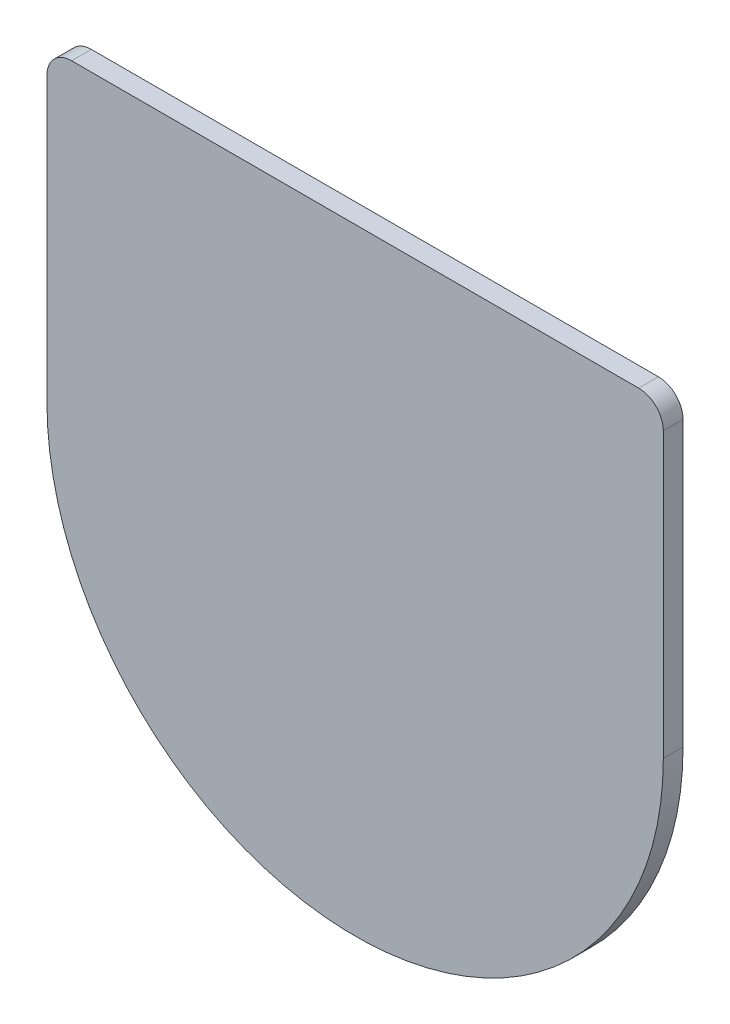
ISO-10303-21;
HEADER;
FILE_DESCRIPTION(('STEP AP214'),'2;1');
FILE_NAME('part.step','',(''),(''),'','','');
FILE_SCHEMA(('AUTOMOTIVE_DESIGN { 1 0 10303 214 1 1 1 1 }'));
ENDSEC;
DATA;
#1=APPLICATION_CONTEXT('core data for automotive mechanical design processes');
#2=APPLICATION_PROTOCOL_DEFINITION('international standard','automotive_design',2000,#1);
#3=PRODUCT_CONTEXT('',#1,'mechanical');
#4=PRODUCT('Part','Part','',(#3));
#5=PRODUCT_RELATED_PRODUCT_CATEGORY('part','',(#4));
#6=PRODUCT_DEFINITION_FORMATION('','',#4);
#7=PRODUCT_DEFINITION_CONTEXT('part definition',#1,'design');
#8=PRODUCT_DEFINITION('design','',#6,#7);
#9=PRODUCT_DEFINITION_SHAPE('','',#8);
#10=(LENGTH_UNIT() NAMED_UNIT(*) SI_UNIT(.MILLI.,.METRE.));
#11=(NAMED_UNIT(*) PLANE_ANGLE_UNIT() SI_UNIT($,.RADIAN.));
#12=(NAMED_UNIT(*) SI_UNIT($,.STERADIAN.) SOLID_ANGLE_UNIT());
#13=UNCERTAINTY_MEASURE_WITH_UNIT(LENGTH_MEASURE(1.E-05),#10,'distance_accuracy_value','');
#14=(GEOMETRIC_REPRESENTATION_CONTEXT(3) GLOBAL_UNCERTAINTY_ASSIGNED_CONTEXT((#13)) GLOBAL_UNIT_ASSIGNED_CONTEXT((#10,
#11,#12)) REPRESENTATION_CONTEXT('',''));
#15=CARTESIAN_POINT('',(0.,0.,0.));
#16=DIRECTION('',(0.,0.,1.));
#17=DIRECTION('',(1.,0.,0.));
#18=AXIS2_PLACEMENT_3D('',#15,#16,#17);
#19=CARTESIAN_POINT('',(0.,-62.5,8.));
#20=DIRECTION('',(0.,0.,-1.));
#21=DIRECTION('',(-1.,0.,0.));
#22=AXIS2_PLACEMENT_3D('',#19,#20,#21);
#23=CYLINDRICAL_SURFACE('',#22,125.);
#24=CARTESIAN_POINT('',(0.,-62.5,0.));
#25=DIRECTION('',(0.,0.,1.));
#26=DIRECTION('',(1.,0.,0.));
#27=AXIS2_PLACEMENT_3D('',#24,#25,#26);
#28=CIRCLE('',#27,125.);
#29=CARTESIAN_POINT('',(-125.,-62.5,0.));
#30=VERTEX_POINT('',#29);
#31=CARTESIAN_POINT('',(125.,-62.5,0.));
#32=VERTEX_POINT('',#31);
#33=EDGE_CURVE('E121',#30,#32,#28,.T.);
#34=ORIENTED_EDGE('',*,*,#33,.T.);
#35=DIRECTION('',(0.,0.,-1.));
#36=VECTOR('',#35,1.);
#37=CARTESIAN_POINT('',(125.,-62.5,8.));
#38=LINE('',#37,#36);
#39=CARTESIAN_POINT('',(125.,-62.5,8.));
#40=VERTEX_POINT('',#39);
#41=EDGE_CURVE('E11',#40,#32,#38,.T.);
#42=ORIENTED_EDGE('',*,*,#41,.F.);
#43=CARTESIAN_POINT('',(0.,-62.5,8.));
#44=DIRECTION('',(0.,0.,1.));
#45=DIRECTION('',(1.,0.,0.));
#46=AXIS2_PLACEMENT_3D('',#43,#44,#45);
#47=CIRCLE('',#46,125.);
#48=CARTESIAN_POINT('',(-125.,-62.5,8.));
#49=VERTEX_POINT('',#48);
#50=EDGE_CURVE('E131',#49,#40,#47,.T.);
#51=ORIENTED_EDGE('',*,*,#50,.F.);
#52=DIRECTION('',(0.,0.,-1.));
#53=VECTOR('',#52,1.);
#54=CARTESIAN_POINT('',(-125.,-62.5,8.));
#55=LINE('',#54,#53);
#56=EDGE_CURVE('E117',#49,#30,#55,.T.);
#57=ORIENTED_EDGE('',*,*,#56,.T.);
#58=EDGE_LOOP('',(#34,#42,#51,#57));
#59=FACE_BOUND('',#58,.T.);
#60=ADVANCED_FACE('F37',(#59),#23,.T.);
#61=CARTESIAN_POINT('',(125.,-62.5,8.));
#62=DIRECTION('',(-1.,0.,0.));
#63=DIRECTION('',(0.,-1.,0.));
#64=AXIS2_PLACEMENT_3D('',#61,#62,#63);
#65=PLANE('',#64);
#66=DIRECTION('',(0.,1.,0.));
#67=VECTOR('',#66,1.);
#68=CARTESIAN_POINT('',(125.,-62.5,0.));
#69=LINE('',#68,#67);
#70=CARTESIAN_POINT('',(125.,52.5,0.));
#71=VERTEX_POINT('',#70);
#72=EDGE_CURVE('E124',#32,#71,#69,.T.);
#73=ORIENTED_EDGE('',*,*,#72,.T.);
#74=DIRECTION('',(0.,0.,-1.));
#75=VECTOR('',#74,1.);
#76=CARTESIAN_POINT('',(125.,52.5,8.));
#77=LINE('',#76,#75);
#78=CARTESIAN_POINT('',(125.,52.5,8.));
#79=VERTEX_POINT('',#78);
#80=EDGE_CURVE('E45',#79,#71,#77,.T.);
#81=ORIENTED_EDGE('',*,*,#80,.F.);
#82=DIRECTION('',(0.,1.,0.));
#83=VECTOR('',#82,1.);
#84=CARTESIAN_POINT('',(125.,-62.5,8.));
#85=LINE('',#84,#83);
#86=EDGE_CURVE('E90',#40,#79,#85,.T.);
#87=ORIENTED_EDGE('',*,*,#86,.F.);
#88=ORIENTED_EDGE('',*,*,#41,.T.);
#89=EDGE_LOOP('',(#73,#81,#87,#88));
#90=FACE_BOUND('',#89,.T.);
#91=ADVANCED_FACE('F155',(#90),#65,.F.);
#92=CARTESIAN_POINT('',(115.,52.5,8.));
#93=DIRECTION('',(0.,0.,-1.));
#94=DIRECTION('',(-1.,0.,0.));
#95=AXIS2_PLACEMENT_3D('',#92,#93,#94);
#96=CYLINDRICAL_SURFACE('',#95,10.);
#97=CARTESIAN_POINT('',(115.,52.5,0.));
#98=DIRECTION('',(0.,0.,1.));
#99=DIRECTION('',(-1.,0.,0.));
#100=AXIS2_PLACEMENT_3D('',#97,#98,#99);
#101=CIRCLE('',#100,10.);
#102=CARTESIAN_POINT('',(115.,62.5,0.));
#103=VERTEX_POINT('',#102);
#104=EDGE_CURVE('E126',#71,#103,#101,.T.);
#105=ORIENTED_EDGE('',*,*,#104,.T.);
#106=DIRECTION('',(0.,0.,-1.));
#107=VECTOR('',#106,1.);
#108=CARTESIAN_POINT('',(115.,62.5,8.));
#109=LINE('',#108,#107);
#110=CARTESIAN_POINT('',(115.,62.5,8.));
#111=VERTEX_POINT('',#110);
#112=EDGE_CURVE('E112',#111,#103,#109,.T.);
#113=ORIENTED_EDGE('',*,*,#112,.F.);
#114=CARTESIAN_POINT('',(115.,52.5,8.));
#115=DIRECTION('',(0.,0.,1.));
#116=DIRECTION('',(-1.,0.,0.));
#117=AXIS2_PLACEMENT_3D('',#114,#115,#116);
#118=CIRCLE('',#117,10.);
#119=EDGE_CURVE('E103',#79,#111,#118,.T.);
#120=ORIENTED_EDGE('',*,*,#119,.F.);
#121=ORIENTED_EDGE('',*,*,#80,.T.);
#122=EDGE_LOOP('',(#105,#113,#120,#121));
#123=FACE_BOUND('',#122,.T.);
#124=ADVANCED_FACE('F137',(#123),#96,.T.);
#125=CARTESIAN_POINT('',(-115.,62.5,8.));
#126=DIRECTION('',(0.,-1.,0.));
#127=DIRECTION('',(0.,0.,-1.));
#128=AXIS2_PLACEMENT_3D('',#125,#126,#127);
#129=PLANE('',#128);
#130=DIRECTION('',(-1.,0.,0.));
#131=VECTOR('',#130,1.);
#132=CARTESIAN_POINT('',(-115.,62.5,0.));
#133=LINE('',#132,#131);
#134=CARTESIAN_POINT('',(-115.,62.5,0.));
#135=VERTEX_POINT('',#134);
#136=EDGE_CURVE('E111',#103,#135,#133,.T.);
#137=ORIENTED_EDGE('',*,*,#136,.T.);
#138=DIRECTION('',(0.,0.,-1.));
#139=VECTOR('',#138,1.);
#140=CARTESIAN_POINT('',(-115.,62.5,8.));
#141=LINE('',#140,#139);
#142=CARTESIAN_POINT('',(-115.,62.5,8.));
#143=VERTEX_POINT('',#142);
#144=EDGE_CURVE('E108',#143,#135,#141,.T.);
#145=ORIENTED_EDGE('',*,*,#144,.F.);
#146=DIRECTION('',(-1.,0.,0.));
#147=VECTOR('',#146,1.);
#148=CARTESIAN_POINT('',(-115.,62.5,8.));
#149=LINE('',#148,#147);
#150=EDGE_CURVE('E97',#111,#143,#149,.T.);
#151=ORIENTED_EDGE('',*,*,#150,.F.);
#152=ORIENTED_EDGE('',*,*,#112,.T.);
#153=EDGE_LOOP('',(#137,#145,#151,#152));
#154=FACE_BOUND('',#153,.T.);
#155=ADVANCED_FACE('F109',(#154),#129,.F.);
#156=CARTESIAN_POINT('',(-115.,52.5,8.));
#157=DIRECTION('',(0.,0.,-1.));
#158=DIRECTION('',(-1.,0.,0.));
#159=AXIS2_PLACEMENT_3D('',#156,#157,#158);
#160=CYLINDRICAL_SURFACE('',#159,10.);
#161=CARTESIAN_POINT('',(-115.,52.5,0.));
#162=DIRECTION('',(0.,0.,1.));
#163=DIRECTION('',(-1.,0.,0.));
#164=AXIS2_PLACEMENT_3D('',#161,#162,#163);
#165=CIRCLE('',#164,10.);
#166=CARTESIAN_POINT('',(-125.,52.5,0.));
#167=VERTEX_POINT('',#166);
#168=EDGE_CURVE('E76',#135,#167,#165,.T.);
#169=ORIENTED_EDGE('',*,*,#168,.T.);
#170=DIRECTION('',(0.,0.,-1.));
#171=VECTOR('',#170,1.);
#172=CARTESIAN_POINT('',(-125.,52.5,8.));
#173=LINE('',#172,#171);
#174=CARTESIAN_POINT('',(-125.,52.5,8.));
#175=VERTEX_POINT('',#174);
#176=EDGE_CURVE('E113',#175,#167,#173,.T.);
#177=ORIENTED_EDGE('',*,*,#176,.F.);
#178=CARTESIAN_POINT('',(-115.,52.5,8.));
#179=DIRECTION('',(0.,0.,1.));
#180=DIRECTION('',(-1.,0.,0.));
#181=AXIS2_PLACEMENT_3D('',#178,#179,#180);
#182=CIRCLE('',#181,10.);
#183=EDGE_CURVE('E101',#143,#175,#182,.T.);
#184=ORIENTED_EDGE('',*,*,#183,.F.);
#185=ORIENTED_EDGE('',*,*,#144,.T.);
#186=EDGE_LOOP('',(#169,#177,#184,#185));
#187=FACE_BOUND('',#186,.T.);
#188=ADVANCED_FACE('F115',(#187),#160,.T.);
#189=CARTESIAN_POINT('',(-125.,-62.5,8.));
#190=DIRECTION('',(1.,0.,0.));
#191=DIRECTION('',(0.,1.,0.));
#192=AXIS2_PLACEMENT_3D('',#189,#190,#191);
#193=PLANE('',#192);
#194=DIRECTION('',(0.,-1.,0.));
#195=VECTOR('',#194,1.);
#196=CARTESIAN_POINT('',(-125.,-62.5,0.));
#197=LINE('',#196,#195);
#198=EDGE_CURVE('E82',#167,#30,#197,.T.);
#199=ORIENTED_EDGE('',*,*,#198,.T.);
#200=ORIENTED_EDGE('',*,*,#56,.F.);
#201=DIRECTION('',(0.,-1.,0.));
#202=VECTOR('',#201,1.);
#203=CARTESIAN_POINT('',(-125.,-62.5,8.));
#204=LINE('',#203,#202);
#205=EDGE_CURVE('E53',#175,#49,#204,.T.);
#206=ORIENTED_EDGE('',*,*,#205,.F.);
#207=ORIENTED_EDGE('',*,*,#176,.T.);
#208=EDGE_LOOP('',(#199,#200,#206,#207));
#209=FACE_BOUND('',#208,.T.);
#210=ADVANCED_FACE('F144',(#209),#193,.F.);
#211=CARTESIAN_POINT('',(0.,-62.5,8.));
#212=DIRECTION('',(0.,0.,1.));
#213=DIRECTION('',(1.,0.,0.));
#214=AXIS2_PLACEMENT_3D('',#211,#212,#213);
#215=PLANE('',#214);
#216=ORIENTED_EDGE('',*,*,#50,.T.);
#217=ORIENTED_EDGE('',*,*,#86,.T.);
#218=ORIENTED_EDGE('',*,*,#119,.T.);
#219=ORIENTED_EDGE('',*,*,#150,.T.);
#220=ORIENTED_EDGE('',*,*,#183,.T.);
#221=ORIENTED_EDGE('',*,*,#205,.T.);
#222=EDGE_LOOP('',(#216,#217,#218,#219,#220,#221));
#223=FACE_BOUND('',#222,.T.);
#224=ADVANCED_FACE('F99',(#223),#215,.T.);
#225=CARTESIAN_POINT('',(0.,-62.5,0.));
#226=DIRECTION('',(0.,0.,1.));
#227=DIRECTION('',(1.,0.,0.));
#228=AXIS2_PLACEMENT_3D('',#225,#226,#227);
#229=PLANE('',#228);
#230=ORIENTED_EDGE('',*,*,#33,.F.);
#231=ORIENTED_EDGE('',*,*,#198,.F.);
#232=ORIENTED_EDGE('',*,*,#168,.F.);
#233=ORIENTED_EDGE('',*,*,#136,.F.);
#234=ORIENTED_EDGE('',*,*,#104,.F.);
#235=ORIENTED_EDGE('',*,*,#72,.F.);
#236=EDGE_LOOP('',(#230,#231,#232,#233,#234,#235));
#237=FACE_BOUND('',#236,.T.);
#238=ADVANCED_FACE('F140',(#237),#229,.F.);
#239=CLOSED_SHELL('',(#60,#91,#124,#155,#188,#210,#224,#238));
#240=MANIFOLD_SOLID_BREP('B2',#239);
#241=ADVANCED_BREP_SHAPE_REPRESENTATION('',(#18,#240),#14);
#242=SHAPE_DEFINITION_REPRESENTATION(#9,#241);
ENDSEC;
END-ISO-10303-21;
